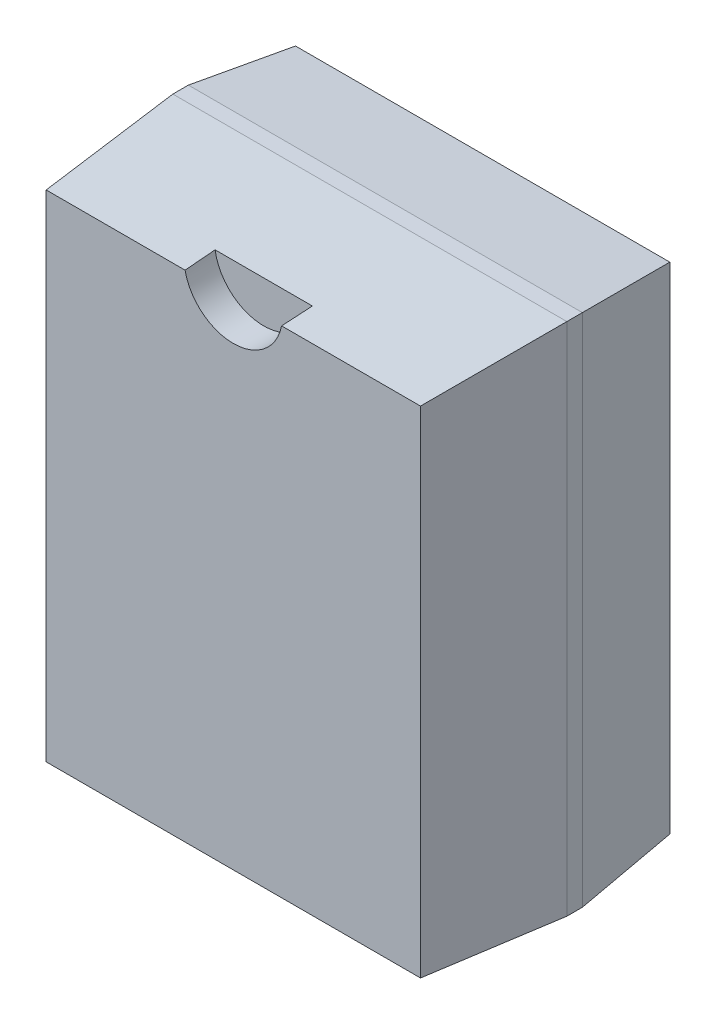
ISO-10303-21;
HEADER;
FILE_DESCRIPTION(('STEP AP214'),'2;1');
FILE_NAME('part.step','',(''),(''),'','','');
FILE_SCHEMA(('AUTOMOTIVE_DESIGN { 1 0 10303 214 1 1 1 1 }'));
ENDSEC;
DATA;
#1=APPLICATION_CONTEXT('core data for automotive mechanical design processes');
#2=APPLICATION_PROTOCOL_DEFINITION('international standard','automotive_design',2000,#1);
#3=PRODUCT_CONTEXT('',#1,'mechanical');
#4=PRODUCT('Part','Part','',(#3));
#5=PRODUCT_RELATED_PRODUCT_CATEGORY('part','',(#4));
#6=PRODUCT_DEFINITION_FORMATION('','',#4);
#7=PRODUCT_DEFINITION_CONTEXT('part definition',#1,'design');
#8=PRODUCT_DEFINITION('design','',#6,#7);
#9=PRODUCT_DEFINITION_SHAPE('','',#8);
#10=(LENGTH_UNIT() NAMED_UNIT(*) SI_UNIT(.MILLI.,.METRE.));
#11=(NAMED_UNIT(*) PLANE_ANGLE_UNIT() SI_UNIT($,.RADIAN.));
#12=(NAMED_UNIT(*) SI_UNIT($,.STERADIAN.) SOLID_ANGLE_UNIT());
#13=UNCERTAINTY_MEASURE_WITH_UNIT(LENGTH_MEASURE(1.E-05),#10,'distance_accuracy_value','');
#14=(GEOMETRIC_REPRESENTATION_CONTEXT(3) GLOBAL_UNCERTAINTY_ASSIGNED_CONTEXT((#13)) GLOBAL_UNIT_ASSIGNED_CONTEXT((#10,
#11,#12)) REPRESENTATION_CONTEXT('',''));
#15=CARTESIAN_POINT('',(0.,0.,0.));
#16=DIRECTION('',(0.,0.,1.));
#17=DIRECTION('',(1.,0.,0.));
#18=AXIS2_PLACEMENT_3D('',#15,#16,#17);
#19=CARTESIAN_POINT('',(0.,4.15,4.41));
#20=DIRECTION('',(0.,0.,1.));
#21=DIRECTION('',(1.,0.,0.));
#22=AXIS2_PLACEMENT_3D('',#19,#20,#21);
#23=PLANE('',#22);
#24=DIRECTION('',(-1.,0.,0.));
#25=VECTOR('',#24,1.);
#26=CARTESIAN_POINT('',(-1.5875,4.026607954545,4.41));
#27=LINE('',#26,#25);
#28=CARTESIAN_POINT('',(0.784100418071,4.026607954545,4.41));
#29=VERTEX_POINT('',#28);
#30=CARTESIAN_POINT('',(-0.784100418071,4.026607954545,4.41));
#31=VERTEX_POINT('',#30);
#32=EDGE_CURVE('E184',#29,#31,#27,.T.);
#33=ORIENTED_EDGE('',*,*,#32,.T.);
#34=CARTESIAN_POINT('',(0.,4.15,4.41));
#35=DIRECTION('',(0.,0.,1.));
#36=DIRECTION('',(1.,0.,0.));
#37=AXIS2_PLACEMENT_3D('',#34,#35,#36);
#38=CIRCLE('',#37,0.79375);
#39=EDGE_CURVE('E11',#31,#29,#38,.T.);
#40=ORIENTED_EDGE('',*,*,#39,.T.);
#41=EDGE_LOOP('',(#33,#40));
#42=FACE_BOUND('',#41,.T.);
#43=ADVANCED_FACE('F16',(#42),#23,.T.);
#44=CARTESIAN_POINT('',(0.,4.15,4.41));
#45=DIRECTION('',(0.,0.,1.));
#46=DIRECTION('',(1.,0.,0.));
#47=AXIS2_PLACEMENT_3D('',#44,#45,#46);
#48=CYLINDRICAL_SURFACE('',#47,0.79375);
#49=CARTESIAN_POINT('',(0.,4.15,2.7));
#50=DIRECTION('',(0.,0.99740665594582,0.071971957559707));
#51=DIRECTION('',(0.,-0.071971957559707,0.99740665594582));
#52=AXIS2_PLACEMENT_3D('',#49,#50,#51);
#53=ELLIPSE('',#52,11.028600956717,0.79375);
#54=CARTESIAN_POINT('',(0.777712993334,3.99125,4.9));
#55=VERTEX_POINT('',#54);
#56=EDGE_CURVE('E187',#55,#29,#53,.T.);
#57=ORIENTED_EDGE('',*,*,#56,.T.);
#58=ORIENTED_EDGE('',*,*,#39,.F.);
#59=CARTESIAN_POINT('',(0.,4.15,2.7));
#60=DIRECTION('',(0.,0.99740665594582,0.071971957559707));
#61=DIRECTION('',(0.,-0.071971957559707,0.99740665594582));
#62=AXIS2_PLACEMENT_3D('',#59,#60,#61);
#63=ELLIPSE('',#62,11.028600956717,0.79375);
#64=CARTESIAN_POINT('',(-0.777712993334,3.99125,4.9));
#65=VERTEX_POINT('',#64);
#66=EDGE_CURVE('E188',#31,#65,#63,.T.);
#67=ORIENTED_EDGE('',*,*,#66,.T.);
#68=CARTESIAN_POINT('',(0.,4.15,4.9));
#69=DIRECTION('',(0.,0.,1.));
#70=DIRECTION('',(1.,0.,0.));
#71=AXIS2_PLACEMENT_3D('',#68,#69,#70);
#72=CIRCLE('',#71,0.79375);
#73=EDGE_CURVE('E197',#65,#55,#72,.T.);
#74=ORIENTED_EDGE('',*,*,#73,.T.);
#75=EDGE_LOOP('',(#57,#58,#67,#74));
#76=FACE_BOUND('',#75,.T.);
#77=ADVANCED_FACE('F292',(#76),#48,.F.);
#78=CARTESIAN_POINT('',(3.095625,-4.15,3.8));
#79=DIRECTION('',(0.99740665594582,0.,0.071971957559707));
#80=DIRECTION('',(0.,-1.,0.));
#81=AXIS2_PLACEMENT_3D('',#78,#79,#80);
#82=PLANE('',#81);
#83=DIRECTION('',(-0.0717862726030698,0.0717862726030698,0.994833384105859));
#84=VECTOR('',#83,1.);
#85=CARTESIAN_POINT('',(3.079672411855,-4.054672411855,4.021075237279));
#86=LINE('',#85,#84);
#87=CARTESIAN_POINT('',(3.175,-4.15,2.7));
#88=VERTEX_POINT('',#87);
#89=CARTESIAN_POINT('',(3.01625,-3.99125,4.9));
#90=VERTEX_POINT('',#89);
#91=EDGE_CURVE('E181',#88,#90,#86,.T.);
#92=ORIENTED_EDGE('',*,*,#91,.F.);
#93=DIRECTION('',(0.,1.,0.));
#94=VECTOR('',#93,1.);
#95=CARTESIAN_POINT('',(3.175,-4.15,2.7));
#96=LINE('',#95,#94);
#97=CARTESIAN_POINT('',(3.175,4.15,2.7));
#98=VERTEX_POINT('',#97);
#99=EDGE_CURVE('E223',#88,#98,#96,.T.);
#100=ORIENTED_EDGE('',*,*,#99,.T.);
#101=DIRECTION('',(-0.0717862726030698,-0.0717862726030698,0.994833384105859));
#102=VECTOR('',#101,1.);
#103=CARTESIAN_POINT('',(3.058286345778,4.033286345778,4.317449066379));
#104=LINE('',#103,#102);
#105=CARTESIAN_POINT('',(3.01625,3.99125,4.9));
#106=VERTEX_POINT('',#105);
#107=EDGE_CURVE('E26',#98,#106,#104,.T.);
#108=ORIENTED_EDGE('',*,*,#107,.T.);
#109=DIRECTION('',(0.,1.,0.));
#110=VECTOR('',#109,1.);
#111=CARTESIAN_POINT('',(3.01625,-4.15,4.9));
#112=LINE('',#111,#110);
#113=EDGE_CURVE('E63',#90,#106,#112,.T.);
#114=ORIENTED_EDGE('',*,*,#113,.F.);
#115=EDGE_LOOP('',(#92,#100,#108,#114));
#116=FACE_BOUND('',#115,.T.);
#117=ADVANCED_FACE('F260',(#116),#82,.T.);
#118=CARTESIAN_POINT('',(3.095625,-4.15,1.666));
#119=DIRECTION('',(-0.994913931414189,0.,0.100728690441019));
#120=DIRECTION('',(0.,1.,0.));
#121=AXIS2_PLACEMENT_3D('',#118,#119,#120);
#122=PLANE('',#121);
#123=DIRECTION('',(0.,1.,0.));
#124=VECTOR('',#123,1.);
#125=CARTESIAN_POINT('',(3.01625,-4.15,0.882));
#126=LINE('',#125,#124);
#127=CARTESIAN_POINT('',(3.01625,-3.99125,0.882));
#128=VERTEX_POINT('',#127);
#129=CARTESIAN_POINT('',(3.01625,3.99125,0.882));
#130=VERTEX_POINT('',#129);
#131=EDGE_CURVE('E76',#128,#130,#126,.T.);
#132=ORIENTED_EDGE('',*,*,#131,.T.);
#133=DIRECTION('',(-0.100221536287951,-0.100221536287951,-0.989904685981517));
#134=VECTOR('',#133,1.);
#135=CARTESIAN_POINT('',(3.022847360624,3.997847360624,0.947163221781));
#136=LINE('',#135,#134);
#137=CARTESIAN_POINT('',(3.175,4.15,2.45));
#138=VERTEX_POINT('',#137);
#139=EDGE_CURVE('E175',#138,#130,#136,.T.);
#140=ORIENTED_EDGE('',*,*,#139,.F.);
#141=DIRECTION('',(0.,1.,0.));
#142=VECTOR('',#141,1.);
#143=CARTESIAN_POINT('',(3.175,-4.15,2.45));
#144=LINE('',#143,#142);
#145=CARTESIAN_POINT('',(3.175,-4.15,2.45));
#146=VERTEX_POINT('',#145);
#147=EDGE_CURVE('E224',#146,#138,#144,.T.);
#148=ORIENTED_EDGE('',*,*,#147,.F.);
#149=DIRECTION('',(-0.100221536287951,0.100221536287951,-0.989904685981517));
#150=VECTOR('',#149,1.);
#151=CARTESIAN_POINT('',(3.064531439418,-4.039531439418,1.358883760673));
#152=LINE('',#151,#150);
#153=EDGE_CURVE('E210',#146,#128,#152,.T.);
#154=ORIENTED_EDGE('',*,*,#153,.T.);
#155=EDGE_LOOP('',(#132,#140,#148,#154));
#156=FACE_BOUND('',#155,.T.);
#157=ADVANCED_FACE('F277',(#156),#122,.F.);
#158=CARTESIAN_POINT('',(-3.175,4.070625,3.8));
#159=DIRECTION('',(0.,0.99740665594582,0.071971957559707));
#160=DIRECTION('',(1.,0.,0.));
#161=AXIS2_PLACEMENT_3D('',#158,#159,#160);
#162=PLANE('',#161);
#163=DIRECTION('',(1.,0.,0.));
#164=VECTOR('',#163,1.);
#165=CARTESIAN_POINT('',(-3.175,3.99125,4.9));
#166=LINE('',#165,#164);
#167=CARTESIAN_POINT('',(-3.01625,3.99125,4.9));
#168=VERTEX_POINT('',#167);
#169=EDGE_CURVE('E194',#168,#65,#166,.T.);
#170=ORIENTED_EDGE('',*,*,#169,.T.);
#171=ORIENTED_EDGE('',*,*,#66,.F.);
#172=ORIENTED_EDGE('',*,*,#32,.F.);
#173=ORIENTED_EDGE('',*,*,#56,.F.);
#174=DIRECTION('',(1.,0.,0.));
#175=VECTOR('',#174,1.);
#176=CARTESIAN_POINT('',(-3.175,3.99125,4.9));
#177=LINE('',#176,#175);
#178=EDGE_CURVE('E195',#55,#106,#177,.T.);
#179=ORIENTED_EDGE('',*,*,#178,.T.);
#180=ORIENTED_EDGE('',*,*,#107,.F.);
#181=DIRECTION('',(1.,0.,0.));
#182=VECTOR('',#181,1.);
#183=CARTESIAN_POINT('',(-3.175,4.15,2.7));
#184=LINE('',#183,#182);
#185=CARTESIAN_POINT('',(-3.175,4.15,2.7));
#186=VERTEX_POINT('',#185);
#187=EDGE_CURVE('E228',#186,#98,#184,.T.);
#188=ORIENTED_EDGE('',*,*,#187,.F.);
#189=DIRECTION('',(0.0717862726030698,-0.0717862726030698,0.994833384105859));
#190=VECTOR('',#189,1.);
#191=CARTESIAN_POINT('',(-3.074647974645,4.049647974645,4.090705233273));
#192=LINE('',#191,#190);
#193=EDGE_CURVE('E19',#186,#168,#192,.T.);
#194=ORIENTED_EDGE('',*,*,#193,.T.);
#195=EDGE_LOOP('',(#170,#171,#172,#173,#179,#180,#188,#194));
#196=FACE_BOUND('',#195,.T.);
#197=ADVANCED_FACE('F301',(#196),#162,.T.);
#198=CARTESIAN_POINT('',(-3.175,-4.15,4.9));
#199=DIRECTION('',(0.,0.,1.));
#200=DIRECTION('',(1.,0.,0.));
#201=AXIS2_PLACEMENT_3D('',#198,#199,#200);
#202=PLANE('',#201);
#203=DIRECTION('',(0.,1.,0.));
#204=VECTOR('',#203,1.);
#205=CARTESIAN_POINT('',(-3.01625,-4.15,4.9));
#206=LINE('',#205,#204);
#207=CARTESIAN_POINT('',(-3.01625,-3.99125,4.9));
#208=VERTEX_POINT('',#207);
#209=EDGE_CURVE('E211',#208,#168,#206,.T.);
#210=ORIENTED_EDGE('',*,*,#209,.F.);
#211=DIRECTION('',(1.,0.,0.));
#212=VECTOR('',#211,1.);
#213=CARTESIAN_POINT('',(-3.175,-3.99125,4.9));
#214=LINE('',#213,#212);
#215=EDGE_CURVE('E133',#208,#90,#214,.T.);
#216=ORIENTED_EDGE('',*,*,#215,.T.);
#217=ORIENTED_EDGE('',*,*,#113,.T.);
#218=ORIENTED_EDGE('',*,*,#178,.F.);
#219=ORIENTED_EDGE('',*,*,#73,.F.);
#220=ORIENTED_EDGE('',*,*,#169,.F.);
#221=EDGE_LOOP('',(#210,#216,#217,#218,#219,#220));
#222=FACE_BOUND('',#221,.T.);
#223=ADVANCED_FACE('F287',(#222),#202,.T.);
#224=CARTESIAN_POINT('',(-3.175,4.070625,1.666));
#225=DIRECTION('',(0.,-0.994913931414189,0.100728690441019));
#226=DIRECTION('',(-1.,0.,0.));
#227=AXIS2_PLACEMENT_3D('',#224,#225,#226);
#228=PLANE('',#227);
#229=DIRECTION('',(0.100221536287951,-0.100221536287951,-0.989904685981517));
#230=VECTOR('',#229,1.);
#231=CARTESIAN_POINT('',(-3.05473819199,4.02973819199,1.262154236475));
#232=LINE('',#231,#230);
#233=CARTESIAN_POINT('',(-3.175,4.15,2.45));
#234=VERTEX_POINT('',#233);
#235=CARTESIAN_POINT('',(-3.01625,3.99125,0.882));
#236=VERTEX_POINT('',#235);
#237=EDGE_CURVE('E239',#234,#236,#232,.T.);
#238=ORIENTED_EDGE('',*,*,#237,.F.);
#239=DIRECTION('',(1.,0.,0.));
#240=VECTOR('',#239,1.);
#241=CARTESIAN_POINT('',(-3.175,4.15,2.45));
#242=LINE('',#241,#240);
#243=EDGE_CURVE('E232',#234,#138,#242,.T.);
#244=ORIENTED_EDGE('',*,*,#243,.T.);
#245=ORIENTED_EDGE('',*,*,#139,.T.);
#246=DIRECTION('',(1.,0.,0.));
#247=VECTOR('',#246,1.);
#248=CARTESIAN_POINT('',(-3.175,3.99125,0.882));
#249=LINE('',#248,#247);
#250=EDGE_CURVE('E180',#236,#130,#249,.T.);
#251=ORIENTED_EDGE('',*,*,#250,.F.);
#252=EDGE_LOOP('',(#238,#244,#245,#251));
#253=FACE_BOUND('',#252,.T.);
#254=ADVANCED_FACE('F270',(#253),#228,.F.);
#255=CARTESIAN_POINT('',(-3.175,-4.15,0.882));
#256=DIRECTION('',(0.,0.,1.));
#257=DIRECTION('',(1.,0.,0.));
#258=AXIS2_PLACEMENT_3D('',#255,#256,#257);
#259=PLANE('',#258);
#260=ORIENTED_EDGE('',*,*,#250,.T.);
#261=ORIENTED_EDGE('',*,*,#131,.F.);
#262=DIRECTION('',(1.,0.,0.));
#263=VECTOR('',#262,1.);
#264=CARTESIAN_POINT('',(-3.175,-3.99125,0.882));
#265=LINE('',#264,#263);
#266=CARTESIAN_POINT('',(-3.01625,-3.99125,0.882));
#267=VERTEX_POINT('',#266);
#268=EDGE_CURVE('E219',#267,#128,#265,.T.);
#269=ORIENTED_EDGE('',*,*,#268,.F.);
#270=DIRECTION('',(0.,1.,0.));
#271=VECTOR('',#270,1.);
#272=CARTESIAN_POINT('',(-3.01625,-4.15,0.882));
#273=LINE('',#272,#271);
#274=EDGE_CURVE('E214',#267,#236,#273,.T.);
#275=ORIENTED_EDGE('',*,*,#274,.T.);
#276=EDGE_LOOP('',(#260,#261,#269,#275));
#277=FACE_BOUND('',#276,.T.);
#278=ADVANCED_FACE('F278',(#277),#259,.F.);
#279=CARTESIAN_POINT('',(-3.175,-4.070625,3.8));
#280=DIRECTION('',(0.,0.99740665594582,-0.071971957559707));
#281=DIRECTION('',(-1.,0.,0.));
#282=AXIS2_PLACEMENT_3D('',#279,#280,#281);
#283=PLANE('',#282);
#284=DIRECTION('',(0.0717862726030698,0.0717862726030698,0.994833384105859));
#285=VECTOR('',#284,1.);
#286=CARTESIAN_POINT('',(-3.096034040722,-4.071034040722,3.794331404172));
#287=LINE('',#286,#285);
#288=CARTESIAN_POINT('',(-3.175,-4.15,2.7));
#289=VERTEX_POINT('',#288);
#290=EDGE_CURVE('E128',#289,#208,#287,.T.);
#291=ORIENTED_EDGE('',*,*,#290,.F.);
#292=DIRECTION('',(1.,0.,0.));
#293=VECTOR('',#292,1.);
#294=CARTESIAN_POINT('',(-3.175,-4.15,2.7));
#295=LINE('',#294,#293);
#296=EDGE_CURVE('E132',#289,#88,#295,.T.);
#297=ORIENTED_EDGE('',*,*,#296,.T.);
#298=ORIENTED_EDGE('',*,*,#91,.T.);
#299=ORIENTED_EDGE('',*,*,#215,.F.);
#300=EDGE_LOOP('',(#291,#297,#298,#299));
#301=FACE_BOUND('',#300,.T.);
#302=ADVANCED_FACE('F130',(#301),#283,.F.);
#303=CARTESIAN_POINT('',(-3.175,-4.070625,1.666));
#304=DIRECTION('',(0.,-0.994913931414189,-0.100728690441019));
#305=DIRECTION('',(0.,0.100728690441019,-0.994913931414189));
#306=AXIS2_PLACEMENT_3D('',#303,#304,#305);
#307=PLANE('',#306);
#308=ORIENTED_EDGE('',*,*,#268,.T.);
#309=ORIENTED_EDGE('',*,*,#153,.F.);
#310=DIRECTION('',(1.,0.,0.));
#311=VECTOR('',#310,1.);
#312=CARTESIAN_POINT('',(-3.175,-4.15,2.45));
#313=LINE('',#312,#311);
#314=CARTESIAN_POINT('',(-3.175,-4.15,2.45));
#315=VERTEX_POINT('',#314);
#316=EDGE_CURVE('E152',#315,#146,#313,.T.);
#317=ORIENTED_EDGE('',*,*,#316,.F.);
#318=DIRECTION('',(0.100221536287951,0.100221536287951,-0.989904685981517));
#319=VECTOR('',#318,1.);
#320=CARTESIAN_POINT('',(-3.096422270784,-4.071422270784,1.673874775367));
#321=LINE('',#320,#319);
#322=EDGE_CURVE('E191',#315,#267,#321,.T.);
#323=ORIENTED_EDGE('',*,*,#322,.T.);
#324=EDGE_LOOP('',(#308,#309,#317,#323));
#325=FACE_BOUND('',#324,.T.);
#326=ADVANCED_FACE('F276',(#325),#307,.T.);
#327=CARTESIAN_POINT('',(3.175,-4.15,0.882));
#328=DIRECTION('',(1.,0.,0.));
#329=DIRECTION('',(0.,1.,0.));
#330=AXIS2_PLACEMENT_3D('',#327,#328,#329);
#331=PLANE('',#330);
#332=DIRECTION('',(0.,0.,1.));
#333=VECTOR('',#332,1.);
#334=CARTESIAN_POINT('',(3.175,-4.15,0.882));
#335=LINE('',#334,#333);
#336=EDGE_CURVE('E150',#146,#88,#335,.T.);
#337=ORIENTED_EDGE('',*,*,#336,.F.);
#338=ORIENTED_EDGE('',*,*,#147,.T.);
#339=DIRECTION('',(0.,0.,1.));
#340=VECTOR('',#339,1.);
#341=CARTESIAN_POINT('',(3.175,4.15,0.882));
#342=LINE('',#341,#340);
#343=EDGE_CURVE('E139',#138,#98,#342,.T.);
#344=ORIENTED_EDGE('',*,*,#343,.T.);
#345=ORIENTED_EDGE('',*,*,#99,.F.);
#346=EDGE_LOOP('',(#337,#338,#344,#345));
#347=FACE_BOUND('',#346,.T.);
#348=ADVANCED_FACE('F265',(#347),#331,.T.);
#349=CARTESIAN_POINT('',(-3.175,4.15,0.882));
#350=DIRECTION('',(0.,1.,0.));
#351=DIRECTION('',(1.,0.,0.));
#352=AXIS2_PLACEMENT_3D('',#349,#350,#351);
#353=PLANE('',#352);
#354=ORIENTED_EDGE('',*,*,#343,.F.);
#355=ORIENTED_EDGE('',*,*,#243,.F.);
#356=DIRECTION('',(0.,0.,1.));
#357=VECTOR('',#356,1.);
#358=CARTESIAN_POINT('',(-3.175,4.15,0.882));
#359=LINE('',#358,#357);
#360=EDGE_CURVE('E168',#234,#186,#359,.T.);
#361=ORIENTED_EDGE('',*,*,#360,.T.);
#362=ORIENTED_EDGE('',*,*,#187,.T.);
#363=EDGE_LOOP('',(#354,#355,#361,#362));
#364=FACE_BOUND('',#363,.T.);
#365=ADVANCED_FACE('F264',(#364),#353,.T.);
#366=CARTESIAN_POINT('',(-3.095625,-4.15,3.8));
#367=DIRECTION('',(0.99740665594582,0.,-0.071971957559707));
#368=DIRECTION('',(0.,-1.,0.));
#369=AXIS2_PLACEMENT_3D('',#366,#367,#368);
#370=PLANE('',#369);
#371=ORIENTED_EDGE('',*,*,#209,.T.);
#372=ORIENTED_EDGE('',*,*,#193,.F.);
#373=DIRECTION('',(0.,1.,0.));
#374=VECTOR('',#373,1.);
#375=CARTESIAN_POINT('',(-3.175,-4.15,2.7));
#376=LINE('',#375,#374);
#377=EDGE_CURVE('E158',#289,#186,#376,.T.);
#378=ORIENTED_EDGE('',*,*,#377,.F.);
#379=ORIENTED_EDGE('',*,*,#290,.T.);
#380=EDGE_LOOP('',(#371,#372,#378,#379));
#381=FACE_BOUND('',#380,.T.);
#382=ADVANCED_FACE('F164',(#381),#370,.F.);
#383=CARTESIAN_POINT('',(-3.095625,-4.15,1.666));
#384=DIRECTION('',(-0.994913931414189,0.,-0.100728690441019));
#385=DIRECTION('',(-0.100728690441019,0.,0.994913931414189));
#386=AXIS2_PLACEMENT_3D('',#383,#384,#385);
#387=PLANE('',#386);
#388=ORIENTED_EDGE('',*,*,#322,.F.);
#389=DIRECTION('',(0.,1.,0.));
#390=VECTOR('',#389,1.);
#391=CARTESIAN_POINT('',(-3.175,-4.15,2.45));
#392=LINE('',#391,#390);
#393=EDGE_CURVE('E160',#315,#234,#392,.T.);
#394=ORIENTED_EDGE('',*,*,#393,.T.);
#395=ORIENTED_EDGE('',*,*,#237,.T.);
#396=ORIENTED_EDGE('',*,*,#274,.F.);
#397=EDGE_LOOP('',(#388,#394,#395,#396));
#398=FACE_BOUND('',#397,.T.);
#399=ADVANCED_FACE('F273',(#398),#387,.T.);
#400=CARTESIAN_POINT('',(-3.175,-4.15,0.882));
#401=DIRECTION('',(0.,1.,0.));
#402=DIRECTION('',(1.,0.,0.));
#403=AXIS2_PLACEMENT_3D('',#400,#401,#402);
#404=PLANE('',#403);
#405=ORIENTED_EDGE('',*,*,#296,.F.);
#406=DIRECTION('',(0.,0.,1.));
#407=VECTOR('',#406,1.);
#408=CARTESIAN_POINT('',(-3.175,-4.15,0.882));
#409=LINE('',#408,#407);
#410=EDGE_CURVE('E147',#315,#289,#409,.T.);
#411=ORIENTED_EDGE('',*,*,#410,.F.);
#412=ORIENTED_EDGE('',*,*,#316,.T.);
#413=ORIENTED_EDGE('',*,*,#336,.T.);
#414=EDGE_LOOP('',(#405,#411,#412,#413));
#415=FACE_BOUND('',#414,.T.);
#416=ADVANCED_FACE('F145',(#415),#404,.F.);
#417=CARTESIAN_POINT('',(-3.175,-4.15,0.882));
#418=DIRECTION('',(1.,0.,0.));
#419=DIRECTION('',(0.,1.,0.));
#420=AXIS2_PLACEMENT_3D('',#417,#418,#419);
#421=PLANE('',#420);
#422=ORIENTED_EDGE('',*,*,#377,.T.);
#423=ORIENTED_EDGE('',*,*,#360,.F.);
#424=ORIENTED_EDGE('',*,*,#393,.F.);
#425=ORIENTED_EDGE('',*,*,#410,.T.);
#426=EDGE_LOOP('',(#422,#423,#424,#425));
#427=FACE_BOUND('',#426,.T.);
#428=ADVANCED_FACE('F156',(#427),#421,.F.);
#429=CLOSED_SHELL('',(#43,#77,#117,#157,#197,#223,#254,#278,#302,#326,#348,#365,#382,#399,#416,#428));
#430=MANIFOLD_SOLID_BREP('B1',#429);
#431=ADVANCED_BREP_SHAPE_REPRESENTATION('',(#18,#430),#14);
#432=SHAPE_DEFINITION_REPRESENTATION(#9,#431);
ENDSEC;
END-ISO-10303-21;
